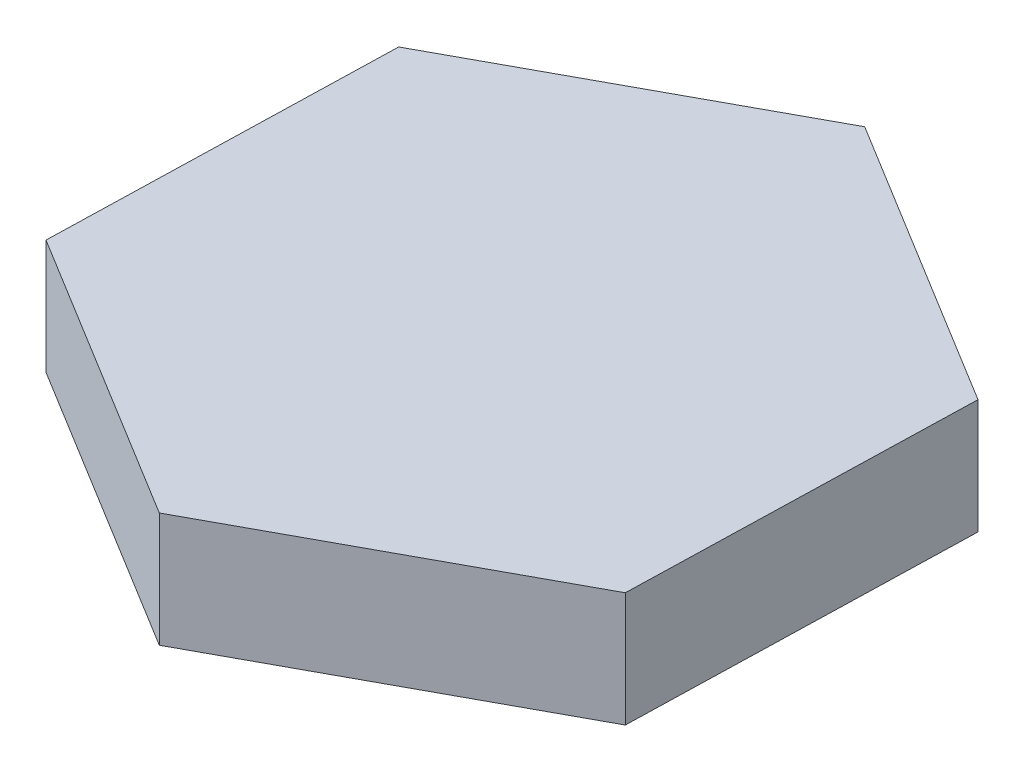
ISO-10303-21;
HEADER;
FILE_DESCRIPTION(('STEP AP214'),'2;1');
FILE_NAME('part.step','',(''),(''),'','','');
FILE_SCHEMA(('AUTOMOTIVE_DESIGN { 1 0 10303 214 1 1 1 1 }'));
ENDSEC;
DATA;
#1=APPLICATION_CONTEXT('core data for automotive mechanical design processes');
#2=APPLICATION_PROTOCOL_DEFINITION('international standard','automotive_design',2000,#1);
#3=PRODUCT_CONTEXT('',#1,'mechanical');
#4=PRODUCT('Part','Part','',(#3));
#5=PRODUCT_RELATED_PRODUCT_CATEGORY('part','',(#4));
#6=PRODUCT_DEFINITION_FORMATION('','',#4);
#7=PRODUCT_DEFINITION_CONTEXT('part definition',#1,'design');
#8=PRODUCT_DEFINITION('design','',#6,#7);
#9=PRODUCT_DEFINITION_SHAPE('','',#8);
#10=(LENGTH_UNIT() NAMED_UNIT(*) SI_UNIT(.MILLI.,.METRE.));
#11=(NAMED_UNIT(*) PLANE_ANGLE_UNIT() SI_UNIT($,.RADIAN.));
#12=(NAMED_UNIT(*) SI_UNIT($,.STERADIAN.) SOLID_ANGLE_UNIT());
#13=UNCERTAINTY_MEASURE_WITH_UNIT(LENGTH_MEASURE(1.E-05),#10,'distance_accuracy_value','');
#14=(GEOMETRIC_REPRESENTATION_CONTEXT(3) GLOBAL_UNCERTAINTY_ASSIGNED_CONTEXT((#13)) GLOBAL_UNIT_ASSIGNED_CONTEXT((#10,
#11,#12)) REPRESENTATION_CONTEXT('',''));
#15=CARTESIAN_POINT('',(0.,0.,0.));
#16=DIRECTION('',(0.,0.,1.));
#17=DIRECTION('',(1.,0.,0.));
#18=AXIS2_PLACEMENT_3D('',#15,#16,#17);
#19=CARTESIAN_POINT('',(26.3694473197482,10.,-14.3056718839425));
#20=DIRECTION('',(-0.52279251068954,0.,0.852459964319104));
#21=DIRECTION('',(0.852459964319104,0.,0.52279251068954));
#22=AXIS2_PLACEMENT_3D('',#19,#20,#21);
#23=PLANE('',#22);
#24=DIRECTION('',(-0.852459964319104,0.,-0.52279251068954));
#25=VECTOR('',#24,1.);
#26=CARTESIAN_POINT('',(26.3694473197482,0.,-14.3056718839425));
#27=LINE('',#26,#25);
#28=CARTESIAN_POINT('',(26.3694473197482,0.,-14.3056718839425));
#29=VERTEX_POINT('',#28);
#30=CARTESIAN_POINT('',(0.795648390175123,0.,-29.9894472046287));
#31=VERTEX_POINT('',#30);
#32=EDGE_CURVE('E117',#29,#31,#27,.T.);
#33=ORIENTED_EDGE('',*,*,#32,.T.);
#34=DIRECTION('',(0.,-1.,0.));
#35=VECTOR('',#34,1.);
#36=CARTESIAN_POINT('',(0.795648390175123,10.,-29.9894472046287));
#37=LINE('',#36,#35);
#38=CARTESIAN_POINT('',(0.795648390175123,10.,-29.9894472046287));
#39=VERTEX_POINT('',#38);
#40=EDGE_CURVE('E11',#39,#31,#37,.T.);
#41=ORIENTED_EDGE('',*,*,#40,.F.);
#42=DIRECTION('',(-0.852459964319104,0.,-0.52279251068954));
#43=VECTOR('',#42,1.);
#44=CARTESIAN_POINT('',(26.3694473197482,10.,-14.3056718839425));
#45=LINE('',#44,#43);
#46=CARTESIAN_POINT('',(26.3694473197482,10.,-14.3056718839425));
#47=VERTEX_POINT('',#46);
#48=EDGE_CURVE('E127',#47,#39,#45,.T.);
#49=ORIENTED_EDGE('',*,*,#48,.F.);
#50=DIRECTION('',(0.,-1.,0.));
#51=VECTOR('',#50,1.);
#52=CARTESIAN_POINT('',(26.3694473197482,10.,-14.3056718839425));
#53=LINE('',#52,#51);
#54=EDGE_CURVE('E113',#47,#29,#53,.T.);
#55=ORIENTED_EDGE('',*,*,#54,.T.);
#56=EDGE_LOOP('',(#33,#41,#49,#55));
#57=FACE_BOUND('',#56,.T.);
#58=ADVANCED_FACE('F33',(#57),#23,.F.);
#59=CARTESIAN_POINT('',(0.795648390175123,10.,-29.9894472046287));
#60=DIRECTION('',(0.47685572946475,0.,0.878981577324941));
#61=DIRECTION('',(0.878981577324941,0.,-0.47685572946475));
#62=AXIS2_PLACEMENT_3D('',#59,#60,#61);
#63=PLANE('',#62);
#64=DIRECTION('',(-0.878981577324941,0.,0.47685572946475));
#65=VECTOR('',#64,1.);
#66=CARTESIAN_POINT('',(0.795648390175123,0.,-29.9894472046287));
#67=LINE('',#66,#65);
#68=CARTESIAN_POINT('',(-25.5737989295731,0.,-15.6837753206862));
#69=VERTEX_POINT('',#68);
#70=EDGE_CURVE('E120',#31,#69,#67,.T.);
#71=ORIENTED_EDGE('',*,*,#70,.T.);
#72=DIRECTION('',(0.,-1.,0.));
#73=VECTOR('',#72,1.);
#74=CARTESIAN_POINT('',(-25.5737989295731,10.,-15.6837753206862));
#75=LINE('',#74,#73);
#76=CARTESIAN_POINT('',(-25.5737989295731,10.,-15.6837753206862));
#77=VERTEX_POINT('',#76);
#78=EDGE_CURVE('E41',#77,#69,#75,.T.);
#79=ORIENTED_EDGE('',*,*,#78,.F.);
#80=DIRECTION('',(-0.878981577324941,0.,0.47685572946475));
#81=VECTOR('',#80,1.);
#82=CARTESIAN_POINT('',(0.795648390175123,10.,-29.9894472046287));
#83=LINE('',#82,#81);
#84=EDGE_CURVE('E86',#39,#77,#83,.T.);
#85=ORIENTED_EDGE('',*,*,#84,.F.);
#86=ORIENTED_EDGE('',*,*,#40,.T.);
#87=EDGE_LOOP('',(#71,#79,#85,#86));
#88=FACE_BOUND('',#87,.T.);
#89=ADVANCED_FACE('F151',(#88),#63,.F.);
#90=CARTESIAN_POINT('',(-25.5737989295731,10.,-15.6837753206862));
#91=DIRECTION('',(0.99964824015429,0.,0.0265216130058372));
#92=DIRECTION('',(0.0265216130058372,0.,-0.99964824015429));
#93=AXIS2_PLACEMENT_3D('',#90,#91,#92);
#94=PLANE('',#93);
#95=DIRECTION('',(-0.0265216130058372,0.,0.99964824015429));
#96=VECTOR('',#95,1.);
#97=CARTESIAN_POINT('',(-25.5737989295731,0.,-15.6837753206862));
#98=LINE('',#97,#96);
#99=CARTESIAN_POINT('',(-26.3694473197482,0.,14.3056718839425));
#100=VERTEX_POINT('',#99);
#101=EDGE_CURVE('E122',#69,#100,#98,.T.);
#102=ORIENTED_EDGE('',*,*,#101,.T.);
#103=DIRECTION('',(0.,-1.,0.));
#104=VECTOR('',#103,1.);
#105=CARTESIAN_POINT('',(-26.3694473197482,10.,14.3056718839425));
#106=LINE('',#105,#104);
#107=CARTESIAN_POINT('',(-26.3694473197482,10.,14.3056718839425));
#108=VERTEX_POINT('',#107);
#109=EDGE_CURVE('E108',#108,#100,#106,.T.);
#110=ORIENTED_EDGE('',*,*,#109,.F.);
#111=DIRECTION('',(-0.0265216130058372,0.,0.99964824015429));
#112=VECTOR('',#111,1.);
#113=CARTESIAN_POINT('',(-25.5737989295731,10.,-15.6837753206862));
#114=LINE('',#113,#112);
#115=EDGE_CURVE('E99',#77,#108,#114,.T.);
#116=ORIENTED_EDGE('',*,*,#115,.F.);
#117=ORIENTED_EDGE('',*,*,#78,.T.);
#118=EDGE_LOOP('',(#102,#110,#116,#117));
#119=FACE_BOUND('',#118,.T.);
#120=ADVANCED_FACE('F133',(#119),#94,.F.);
#121=CARTESIAN_POINT('',(-26.3694473197482,10.,14.3056718839425));
#122=DIRECTION('',(0.522792510689539,0.,-0.852459964319104));
#123=DIRECTION('',(-0.852459964319104,0.,-0.522792510689539));
#124=AXIS2_PLACEMENT_3D('',#121,#122,#123);
#125=PLANE('',#124);
#126=DIRECTION('',(0.852459964319104,0.,0.52279251068954));
#127=VECTOR('',#126,1.);
#128=CARTESIAN_POINT('',(-26.3694473197482,0.,14.3056718839425));
#129=LINE('',#128,#127);
#130=CARTESIAN_POINT('',(-0.795648390175109,0.,29.9894472046287));
#131=VERTEX_POINT('',#130);
#132=EDGE_CURVE('E107',#100,#131,#129,.T.);
#133=ORIENTED_EDGE('',*,*,#132,.T.);
#134=DIRECTION('',(0.,-1.,0.));
#135=VECTOR('',#134,1.);
#136=CARTESIAN_POINT('',(-0.795648390175109,10.,29.9894472046287));
#137=LINE('',#136,#135);
#138=CARTESIAN_POINT('',(-0.795648390175109,10.,29.9894472046287));
#139=VERTEX_POINT('',#138);
#140=EDGE_CURVE('E104',#139,#131,#137,.T.);
#141=ORIENTED_EDGE('',*,*,#140,.F.);
#142=DIRECTION('',(0.852459964319104,0.,0.52279251068954));
#143=VECTOR('',#142,1.);
#144=CARTESIAN_POINT('',(-26.3694473197482,10.,14.3056718839425));
#145=LINE('',#144,#143);
#146=EDGE_CURVE('E93',#108,#139,#145,.T.);
#147=ORIENTED_EDGE('',*,*,#146,.F.);
#148=ORIENTED_EDGE('',*,*,#109,.T.);
#149=EDGE_LOOP('',(#133,#141,#147,#148));
#150=FACE_BOUND('',#149,.T.);
#151=ADVANCED_FACE('F105',(#150),#125,.F.);
#152=CARTESIAN_POINT('',(-0.795648390175109,10.,29.9894472046287));
#153=DIRECTION('',(-0.47685572946475,0.,-0.878981577324941));
#154=DIRECTION('',(-0.878981577324941,0.,0.47685572946475));
#155=AXIS2_PLACEMENT_3D('',#152,#153,#154);
#156=PLANE('',#155);
#157=DIRECTION('',(0.878981577324941,0.,-0.47685572946475));
#158=VECTOR('',#157,1.);
#159=CARTESIAN_POINT('',(-0.795648390175109,0.,29.9894472046287));
#160=LINE('',#159,#158);
#161=CARTESIAN_POINT('',(25.5737989295731,0.,15.6837753206862));
#162=VERTEX_POINT('',#161);
#163=EDGE_CURVE('E72',#131,#162,#160,.T.);
#164=ORIENTED_EDGE('',*,*,#163,.T.);
#165=DIRECTION('',(0.,-1.,0.));
#166=VECTOR('',#165,1.);
#167=CARTESIAN_POINT('',(25.5737989295731,10.,15.6837753206862));
#168=LINE('',#167,#166);
#169=CARTESIAN_POINT('',(25.5737989295731,10.,15.6837753206862));
#170=VERTEX_POINT('',#169);
#171=EDGE_CURVE('E109',#170,#162,#168,.T.);
#172=ORIENTED_EDGE('',*,*,#171,.F.);
#173=DIRECTION('',(0.878981577324941,0.,-0.47685572946475));
#174=VECTOR('',#173,1.);
#175=CARTESIAN_POINT('',(-0.795648390175109,10.,29.9894472046287));
#176=LINE('',#175,#174);
#177=EDGE_CURVE('E97',#139,#170,#176,.T.);
#178=ORIENTED_EDGE('',*,*,#177,.F.);
#179=ORIENTED_EDGE('',*,*,#140,.T.);
#180=EDGE_LOOP('',(#164,#172,#178,#179));
#181=FACE_BOUND('',#180,.T.);
#182=ADVANCED_FACE('F111',(#181),#156,.F.);
#183=CARTESIAN_POINT('',(25.5737989295731,10.,15.6837753206862));
#184=DIRECTION('',(-0.99964824015429,0.,-0.026521613005837));
#185=DIRECTION('',(-0.026521613005837,0.,0.99964824015429));
#186=AXIS2_PLACEMENT_3D('',#183,#184,#185);
#187=PLANE('',#186);
#188=DIRECTION('',(0.026521613005837,0.,-0.99964824015429));
#189=VECTOR('',#188,1.);
#190=CARTESIAN_POINT('',(25.5737989295731,0.,15.6837753206862));
#191=LINE('',#190,#189);
#192=EDGE_CURVE('E78',#162,#29,#191,.T.);
#193=ORIENTED_EDGE('',*,*,#192,.T.);
#194=ORIENTED_EDGE('',*,*,#54,.F.);
#195=DIRECTION('',(0.026521613005837,0.,-0.99964824015429));
#196=VECTOR('',#195,1.);
#197=CARTESIAN_POINT('',(25.5737989295731,10.,15.6837753206862));
#198=LINE('',#197,#196);
#199=EDGE_CURVE('E49',#170,#47,#198,.T.);
#200=ORIENTED_EDGE('',*,*,#199,.F.);
#201=ORIENTED_EDGE('',*,*,#171,.T.);
#202=EDGE_LOOP('',(#193,#194,#200,#201));
#203=FACE_BOUND('',#202,.T.);
#204=ADVANCED_FACE('F140',(#203),#187,.F.);
#205=CARTESIAN_POINT('',(0.,10.,0.));
#206=DIRECTION('',(0.,1.,0.));
#207=DIRECTION('',(0.,0.,1.));
#208=AXIS2_PLACEMENT_3D('',#205,#206,#207);
#209=PLANE('',#208);
#210=ORIENTED_EDGE('',*,*,#48,.T.);
#211=ORIENTED_EDGE('',*,*,#84,.T.);
#212=ORIENTED_EDGE('',*,*,#115,.T.);
#213=ORIENTED_EDGE('',*,*,#146,.T.);
#214=ORIENTED_EDGE('',*,*,#177,.T.);
#215=ORIENTED_EDGE('',*,*,#199,.T.);
#216=EDGE_LOOP('',(#210,#211,#212,#213,#214,#215));
#217=FACE_BOUND('',#216,.T.);
#218=ADVANCED_FACE('F95',(#217),#209,.T.);
#219=CARTESIAN_POINT('',(0.,0.,0.));
#220=DIRECTION('',(0.,1.,0.));
#221=DIRECTION('',(0.,0.,1.));
#222=AXIS2_PLACEMENT_3D('',#219,#220,#221);
#223=PLANE('',#222);
#224=ORIENTED_EDGE('',*,*,#32,.F.);
#225=ORIENTED_EDGE('',*,*,#192,.F.);
#226=ORIENTED_EDGE('',*,*,#163,.F.);
#227=ORIENTED_EDGE('',*,*,#132,.F.);
#228=ORIENTED_EDGE('',*,*,#101,.F.);
#229=ORIENTED_EDGE('',*,*,#70,.F.);
#230=EDGE_LOOP('',(#224,#225,#226,#227,#228,#229));
#231=FACE_BOUND('',#230,.T.);
#232=ADVANCED_FACE('F136',(#231),#223,.F.);
#233=CLOSED_SHELL('',(#58,#89,#120,#151,#182,#204,#218,#232));
#234=MANIFOLD_SOLID_BREP('B2',#233);
#235=ADVANCED_BREP_SHAPE_REPRESENTATION('',(#18,#234),#14);
#236=SHAPE_DEFINITION_REPRESENTATION(#9,#235);
ENDSEC;
END-ISO-10303-21;
